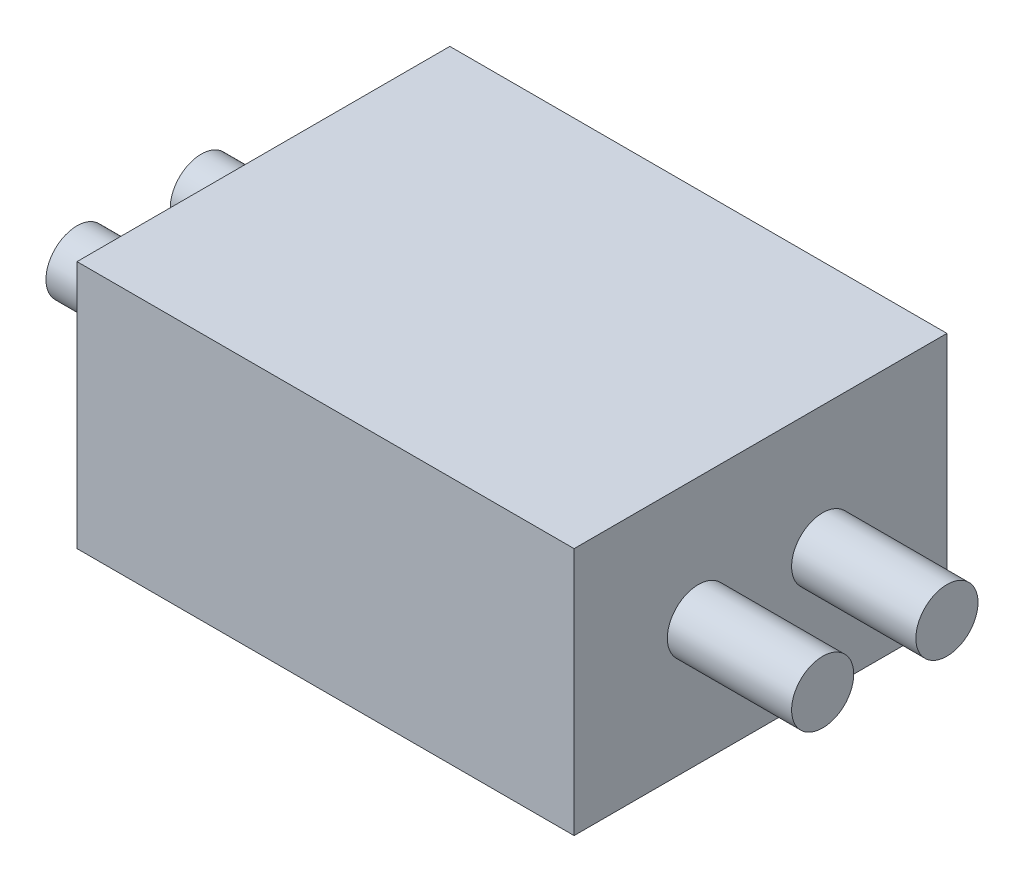
ISO-10303-21;
HEADER;
FILE_DESCRIPTION(('STEP AP214'),'2;1');
FILE_NAME('part.step','',(''),(''),'','','');
FILE_SCHEMA(('AUTOMOTIVE_DESIGN { 1 0 10303 214 1 1 1 1 }'));
ENDSEC;
DATA;
#1=APPLICATION_CONTEXT('core data for automotive mechanical design processes');
#2=APPLICATION_PROTOCOL_DEFINITION('international standard','automotive_design',2000,#1);
#3=PRODUCT_CONTEXT('',#1,'mechanical');
#4=PRODUCT('Part','Part','',(#3));
#5=PRODUCT_RELATED_PRODUCT_CATEGORY('part','',(#4));
#6=PRODUCT_DEFINITION_FORMATION('','',#4);
#7=PRODUCT_DEFINITION_CONTEXT('part definition',#1,'design');
#8=PRODUCT_DEFINITION('design','',#6,#7);
#9=PRODUCT_DEFINITION_SHAPE('','',#8);
#10=(LENGTH_UNIT() NAMED_UNIT(*) SI_UNIT(.MILLI.,.METRE.));
#11=(NAMED_UNIT(*) PLANE_ANGLE_UNIT() SI_UNIT($,.RADIAN.));
#12=(NAMED_UNIT(*) SI_UNIT($,.STERADIAN.) SOLID_ANGLE_UNIT());
#13=UNCERTAINTY_MEASURE_WITH_UNIT(LENGTH_MEASURE(1.E-05),#10,'distance_accuracy_value','');
#14=(GEOMETRIC_REPRESENTATION_CONTEXT(3) GLOBAL_UNCERTAINTY_ASSIGNED_CONTEXT((#13)) GLOBAL_UNIT_ASSIGNED_CONTEXT((#10,
#11,#12)) REPRESENTATION_CONTEXT('',''));
#15=CARTESIAN_POINT('',(0.,0.,0.));
#16=DIRECTION('',(0.,0.,1.));
#17=DIRECTION('',(1.,0.,0.));
#18=AXIS2_PLACEMENT_3D('',#15,#16,#17);
#19=CARTESIAN_POINT('',(4.,4.,3.));
#20=DIRECTION('',(-1.,0.,0.));
#21=DIRECTION('',(0.,0.,1.));
#22=AXIS2_PLACEMENT_3D('',#19,#20,#21);
#23=PLANE('',#22);
#24=CARTESIAN_POINT('',(4.,2.,1.));
#25=DIRECTION('',(-1.,0.,0.));
#26=DIRECTION('',(0.,0.,1.));
#27=AXIS2_PLACEMENT_3D('',#24,#25,#26);
#28=CIRCLE('',#27,0.5);
#29=CARTESIAN_POINT('',(4.,2.,1.5));
#30=VERTEX_POINT('',#29);
#31=EDGE_CURVE('E11',#30,#30,#28,.F.);
#32=ORIENTED_EDGE('',*,*,#31,.F.);
#33=EDGE_LOOP('',(#32));
#34=FACE_BOUND('',#33,.T.);
#35=CARTESIAN_POINT('',(4.,2.,-1.));
#36=DIRECTION('',(-1.,0.,0.));
#37=DIRECTION('',(0.,0.,1.));
#38=AXIS2_PLACEMENT_3D('',#35,#36,#37);
#39=CIRCLE('',#38,0.5);
#40=CARTESIAN_POINT('',(4.,2.,-0.5));
#41=VERTEX_POINT('',#40);
#42=EDGE_CURVE('E61',#41,#41,#39,.F.);
#43=ORIENTED_EDGE('',*,*,#42,.F.);
#44=EDGE_LOOP('',(#43));
#45=FACE_BOUND('',#44,.T.);
#46=DIRECTION('',(0.,0.,-1.));
#47=VECTOR('',#46,1.);
#48=CARTESIAN_POINT('',(4.,0.,3.));
#49=LINE('',#48,#47);
#50=CARTESIAN_POINT('',(4.,0.,3.));
#51=VERTEX_POINT('',#50);
#52=CARTESIAN_POINT('',(4.,0.,-3.));
#53=VERTEX_POINT('',#52);
#54=EDGE_CURVE('E125',#51,#53,#49,.T.);
#55=ORIENTED_EDGE('',*,*,#54,.T.);
#56=DIRECTION('',(0.,-1.,0.));
#57=VECTOR('',#56,1.);
#58=CARTESIAN_POINT('',(4.,4.,-3.));
#59=LINE('',#58,#57);
#60=CARTESIAN_POINT('',(4.,4.,-3.));
#61=VERTEX_POINT('',#60);
#62=EDGE_CURVE('E114',#61,#53,#59,.T.);
#63=ORIENTED_EDGE('',*,*,#62,.F.);
#64=DIRECTION('',(0.,0.,-1.));
#65=VECTOR('',#64,1.);
#66=CARTESIAN_POINT('',(4.,4.,3.));
#67=LINE('',#66,#65);
#68=CARTESIAN_POINT('',(4.,4.,3.));
#69=VERTEX_POINT('',#68);
#70=EDGE_CURVE('E106',#69,#61,#67,.T.);
#71=ORIENTED_EDGE('',*,*,#70,.F.);
#72=DIRECTION('',(0.,-1.,0.));
#73=VECTOR('',#72,1.);
#74=CARTESIAN_POINT('',(4.,4.,3.));
#75=LINE('',#74,#73);
#76=EDGE_CURVE('E121',#69,#51,#75,.T.);
#77=ORIENTED_EDGE('',*,*,#76,.T.);
#78=EDGE_LOOP('',(#55,#63,#71,#77));
#79=FACE_BOUND('',#78,.T.);
#80=ADVANCED_FACE('F51',(#34,#45,#79),#23,.F.);
#81=CARTESIAN_POINT('',(-4.,4.,-3.));
#82=DIRECTION('',(0.,0.,1.));
#83=DIRECTION('',(1.,0.,0.));
#84=AXIS2_PLACEMENT_3D('',#81,#82,#83);
#85=PLANE('',#84);
#86=DIRECTION('',(-1.,0.,0.));
#87=VECTOR('',#86,1.);
#88=CARTESIAN_POINT('',(-4.,0.,-3.));
#89=LINE('',#88,#87);
#90=CARTESIAN_POINT('',(-4.,0.,-3.));
#91=VERTEX_POINT('',#90);
#92=EDGE_CURVE('E112',#53,#91,#89,.T.);
#93=ORIENTED_EDGE('',*,*,#92,.T.);
#94=DIRECTION('',(0.,-1.,0.));
#95=VECTOR('',#94,1.);
#96=CARTESIAN_POINT('',(-4.,4.,-3.));
#97=LINE('',#96,#95);
#98=CARTESIAN_POINT('',(-4.,4.,-3.));
#99=VERTEX_POINT('',#98);
#100=EDGE_CURVE('E110',#99,#91,#97,.T.);
#101=ORIENTED_EDGE('',*,*,#100,.F.);
#102=DIRECTION('',(-1.,0.,0.));
#103=VECTOR('',#102,1.);
#104=CARTESIAN_POINT('',(-4.,4.,-3.));
#105=LINE('',#104,#103);
#106=EDGE_CURVE('E101',#61,#99,#105,.T.);
#107=ORIENTED_EDGE('',*,*,#106,.F.);
#108=ORIENTED_EDGE('',*,*,#62,.T.);
#109=EDGE_LOOP('',(#93,#101,#107,#108));
#110=FACE_BOUND('',#109,.T.);
#111=ADVANCED_FACE('F111',(#110),#85,.F.);
#112=CARTESIAN_POINT('',(-4.,4.,3.));
#113=DIRECTION('',(1.,0.,0.));
#114=DIRECTION('',(0.,0.,-1.));
#115=AXIS2_PLACEMENT_3D('',#112,#113,#114);
#116=PLANE('',#115);
#117=CARTESIAN_POINT('',(-4.,2.,1.));
#118=DIRECTION('',(1.,0.,0.));
#119=DIRECTION('',(0.,0.,-1.));
#120=AXIS2_PLACEMENT_3D('',#117,#118,#119);
#121=CIRCLE('',#120,0.5);
#122=CARTESIAN_POINT('',(-4.,2.,0.5));
#123=VERTEX_POINT('',#122);
#124=EDGE_CURVE('E54',#123,#123,#121,.F.);
#125=ORIENTED_EDGE('',*,*,#124,.F.);
#126=EDGE_LOOP('',(#125));
#127=FACE_BOUND('',#126,.T.);
#128=CARTESIAN_POINT('',(-4.,2.,-1.));
#129=DIRECTION('',(1.,0.,0.));
#130=DIRECTION('',(0.,0.,-1.));
#131=AXIS2_PLACEMENT_3D('',#128,#129,#130);
#132=CIRCLE('',#131,0.5);
#133=CARTESIAN_POINT('',(-4.,2.,-1.5));
#134=VERTEX_POINT('',#133);
#135=EDGE_CURVE('E141',#134,#134,#132,.F.);
#136=ORIENTED_EDGE('',*,*,#135,.F.);
#137=EDGE_LOOP('',(#136));
#138=FACE_BOUND('',#137,.T.);
#139=DIRECTION('',(0.,0.,1.));
#140=VECTOR('',#139,1.);
#141=CARTESIAN_POINT('',(-4.,0.,3.));
#142=LINE('',#141,#140);
#143=CARTESIAN_POINT('',(-4.,0.,3.));
#144=VERTEX_POINT('',#143);
#145=EDGE_CURVE('E87',#91,#144,#142,.T.);
#146=ORIENTED_EDGE('',*,*,#145,.T.);
#147=DIRECTION('',(0.,-1.,0.));
#148=VECTOR('',#147,1.);
#149=CARTESIAN_POINT('',(-4.,4.,3.));
#150=LINE('',#149,#148);
#151=CARTESIAN_POINT('',(-4.,4.,3.));
#152=VERTEX_POINT('',#151);
#153=EDGE_CURVE('E115',#152,#144,#150,.T.);
#154=ORIENTED_EDGE('',*,*,#153,.F.);
#155=DIRECTION('',(0.,0.,1.));
#156=VECTOR('',#155,1.);
#157=CARTESIAN_POINT('',(-4.,4.,3.));
#158=LINE('',#157,#156);
#159=EDGE_CURVE('E104',#99,#152,#158,.T.);
#160=ORIENTED_EDGE('',*,*,#159,.F.);
#161=ORIENTED_EDGE('',*,*,#100,.T.);
#162=EDGE_LOOP('',(#146,#154,#160,#161));
#163=FACE_BOUND('',#162,.T.);
#164=ADVANCED_FACE('F117',(#127,#138,#163),#116,.F.);
#165=CARTESIAN_POINT('',(-4.,4.,3.));
#166=DIRECTION('',(0.,0.,-1.));
#167=DIRECTION('',(-1.,0.,0.));
#168=AXIS2_PLACEMENT_3D('',#165,#166,#167);
#169=PLANE('',#168);
#170=DIRECTION('',(1.,0.,0.));
#171=VECTOR('',#170,1.);
#172=CARTESIAN_POINT('',(-4.,0.,3.));
#173=LINE('',#172,#171);
#174=EDGE_CURVE('E93',#144,#51,#173,.T.);
#175=ORIENTED_EDGE('',*,*,#174,.T.);
#176=ORIENTED_EDGE('',*,*,#76,.F.);
#177=DIRECTION('',(1.,0.,0.));
#178=VECTOR('',#177,1.);
#179=CARTESIAN_POINT('',(-4.,4.,3.));
#180=LINE('',#179,#178);
#181=EDGE_CURVE('E70',#152,#69,#180,.T.);
#182=ORIENTED_EDGE('',*,*,#181,.F.);
#183=ORIENTED_EDGE('',*,*,#153,.T.);
#184=EDGE_LOOP('',(#175,#176,#182,#183));
#185=FACE_BOUND('',#184,.T.);
#186=ADVANCED_FACE('F212',(#185),#169,.F.);
#187=CARTESIAN_POINT('',(0.,4.,0.));
#188=DIRECTION('',(0.,-1.,0.));
#189=DIRECTION('',(0.,0.,-1.));
#190=AXIS2_PLACEMENT_3D('',#187,#188,#189);
#191=PLANE('',#190);
#192=ORIENTED_EDGE('',*,*,#70,.T.);
#193=ORIENTED_EDGE('',*,*,#106,.T.);
#194=ORIENTED_EDGE('',*,*,#159,.T.);
#195=ORIENTED_EDGE('',*,*,#181,.T.);
#196=EDGE_LOOP('',(#192,#193,#194,#195));
#197=FACE_BOUND('',#196,.T.);
#198=ADVANCED_FACE('F102',(#197),#191,.F.);
#199=CARTESIAN_POINT('',(0.,0.,0.));
#200=DIRECTION('',(0.,-1.,0.));
#201=DIRECTION('',(0.,0.,-1.));
#202=AXIS2_PLACEMENT_3D('',#199,#200,#201);
#203=PLANE('',#202);
#204=ORIENTED_EDGE('',*,*,#54,.F.);
#205=ORIENTED_EDGE('',*,*,#174,.F.);
#206=ORIENTED_EDGE('',*,*,#145,.F.);
#207=ORIENTED_EDGE('',*,*,#92,.F.);
#208=EDGE_LOOP('',(#204,#205,#206,#207));
#209=FACE_BOUND('',#208,.T.);
#210=ADVANCED_FACE('F205',(#209),#203,.T.);
#211=CARTESIAN_POINT('',(-6.,2.,-1.));
#212=DIRECTION('',(1.,0.,0.));
#213=DIRECTION('',(0.,0.,-1.));
#214=AXIS2_PLACEMENT_3D('',#211,#212,#213);
#215=PLANE('',#214);
#216=CARTESIAN_POINT('',(-6.,2.,-1.));
#217=DIRECTION('',(1.,0.,0.));
#218=DIRECTION('',(0.,0.,-1.));
#219=AXIS2_PLACEMENT_3D('',#216,#217,#218);
#220=CIRCLE('',#219,0.5);
#221=CARTESIAN_POINT('',(-6.,2.,-1.5));
#222=VERTEX_POINT('',#221);
#223=EDGE_CURVE('E166',#222,#222,#220,.T.);
#224=ORIENTED_EDGE('',*,*,#223,.F.);
#225=EDGE_LOOP('',(#224));
#226=FACE_BOUND('',#225,.T.);
#227=ADVANCED_FACE('F191',(#226),#215,.F.);
#228=CARTESIAN_POINT('',(6.,2.,-1.));
#229=DIRECTION('',(-1.,0.,0.));
#230=DIRECTION('',(0.,0.,1.));
#231=AXIS2_PLACEMENT_3D('',#228,#229,#230);
#232=CYLINDRICAL_SURFACE('',#231,0.5);
#233=ORIENTED_EDGE('',*,*,#223,.T.);
#234=EDGE_LOOP('',(#233));
#235=FACE_BOUND('',#234,.T.);
#236=ORIENTED_EDGE('',*,*,#135,.T.);
#237=EDGE_LOOP('',(#236));
#238=FACE_BOUND('',#237,.T.);
#239=ADVANCED_FACE('F179',(#235,#238),#232,.T.);
#240=CARTESIAN_POINT('',(-6.,2.,1.));
#241=DIRECTION('',(1.,0.,0.));
#242=DIRECTION('',(0.,0.,-1.));
#243=AXIS2_PLACEMENT_3D('',#240,#241,#242);
#244=PLANE('',#243);
#245=CARTESIAN_POINT('',(-6.,2.,1.));
#246=DIRECTION('',(1.,0.,0.));
#247=DIRECTION('',(0.,0.,-1.));
#248=AXIS2_PLACEMENT_3D('',#245,#246,#247);
#249=CIRCLE('',#248,0.5);
#250=CARTESIAN_POINT('',(-6.,2.,0.5));
#251=VERTEX_POINT('',#250);
#252=EDGE_CURVE('E162',#251,#251,#249,.T.);
#253=ORIENTED_EDGE('',*,*,#252,.F.);
#254=EDGE_LOOP('',(#253));
#255=FACE_BOUND('',#254,.T.);
#256=ADVANCED_FACE('F186',(#255),#244,.F.);
#257=CARTESIAN_POINT('',(6.,2.,1.));
#258=DIRECTION('',(-1.,0.,0.));
#259=DIRECTION('',(0.,0.,1.));
#260=AXIS2_PLACEMENT_3D('',#257,#258,#259);
#261=CYLINDRICAL_SURFACE('',#260,0.5);
#262=ORIENTED_EDGE('',*,*,#252,.T.);
#263=EDGE_LOOP('',(#262));
#264=FACE_BOUND('',#263,.T.);
#265=ORIENTED_EDGE('',*,*,#124,.T.);
#266=EDGE_LOOP('',(#265));
#267=FACE_BOUND('',#266,.T.);
#268=ADVANCED_FACE('F177',(#264,#267),#261,.T.);
#269=CARTESIAN_POINT('',(6.,2.,-1.));
#270=DIRECTION('',(1.,0.,0.));
#271=DIRECTION('',(0.,0.,-1.));
#272=AXIS2_PLACEMENT_3D('',#269,#270,#271);
#273=CIRCLE('',#272,0.5);
#274=CARTESIAN_POINT('',(6.,2.,-1.5));
#275=VERTEX_POINT('',#274);
#276=EDGE_CURVE('E156',#275,#275,#273,.T.);
#277=ORIENTED_EDGE('',*,*,#276,.F.);
#278=EDGE_LOOP('',(#277));
#279=FACE_BOUND('',#278,.T.);
#280=ORIENTED_EDGE('',*,*,#42,.T.);
#281=EDGE_LOOP('',(#280));
#282=FACE_BOUND('',#281,.T.);
#283=ADVANCED_FACE('F175',(#279,#282),#232,.T.);
#284=CARTESIAN_POINT('',(6.,2.,-1.));
#285=DIRECTION('',(1.,0.,0.));
#286=DIRECTION('',(0.,0.,-1.));
#287=AXIS2_PLACEMENT_3D('',#284,#285,#286);
#288=PLANE('',#287);
#289=ORIENTED_EDGE('',*,*,#276,.T.);
#290=EDGE_LOOP('',(#289));
#291=FACE_BOUND('',#290,.T.);
#292=ADVANCED_FACE('F173',(#291),#288,.T.);
#293=CARTESIAN_POINT('',(6.,2.,1.));
#294=DIRECTION('',(1.,0.,0.));
#295=DIRECTION('',(0.,0.,-1.));
#296=AXIS2_PLACEMENT_3D('',#293,#294,#295);
#297=CIRCLE('',#296,0.5);
#298=CARTESIAN_POINT('',(6.,2.,0.5));
#299=VERTEX_POINT('',#298);
#300=EDGE_CURVE('E129',#299,#299,#297,.T.);
#301=ORIENTED_EDGE('',*,*,#300,.F.);
#302=EDGE_LOOP('',(#301));
#303=FACE_BOUND('',#302,.T.);
#304=ORIENTED_EDGE('',*,*,#31,.T.);
#305=EDGE_LOOP('',(#304));
#306=FACE_BOUND('',#305,.T.);
#307=ADVANCED_FACE('F184',(#303,#306),#261,.T.);
#308=CARTESIAN_POINT('',(6.,2.,1.));
#309=DIRECTION('',(1.,0.,0.));
#310=DIRECTION('',(0.,0.,-1.));
#311=AXIS2_PLACEMENT_3D('',#308,#309,#310);
#312=PLANE('',#311);
#313=ORIENTED_EDGE('',*,*,#300,.T.);
#314=EDGE_LOOP('',(#313));
#315=FACE_BOUND('',#314,.T.);
#316=ADVANCED_FACE('F289',(#315),#312,.T.);
#317=CLOSED_SHELL('',(#80,#111,#164,#186,#198,#210,#227,#239,#256,#268,#283,#292,#307,#316));
#318=MANIFOLD_SOLID_BREP('B2',#317);
#319=ADVANCED_BREP_SHAPE_REPRESENTATION('',(#18,#318),#14);
#320=SHAPE_DEFINITION_REPRESENTATION(#9,#319);
ENDSEC;
END-ISO-10303-21;
